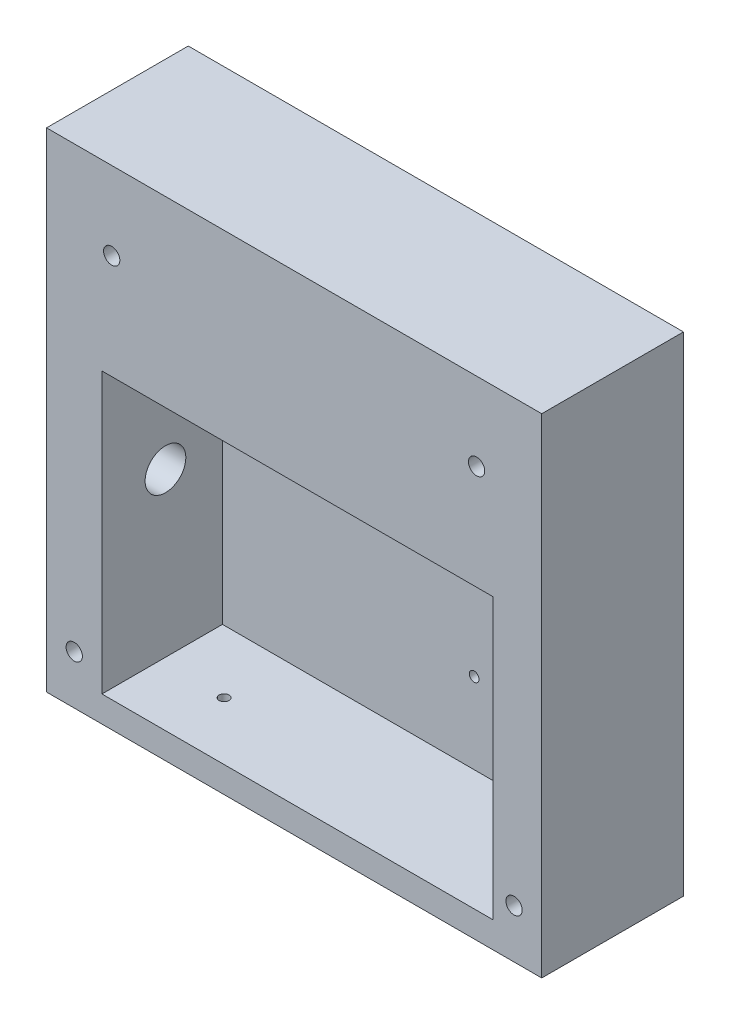
ISO-10303-21;
HEADER;
FILE_DESCRIPTION(('STEP AP214'),'2;1');
FILE_NAME('part.step','',(''),(''),'','','');
FILE_SCHEMA(('AUTOMOTIVE_DESIGN { 1 0 10303 214 1 1 1 1 }'));
ENDSEC;
DATA;
#1=APPLICATION_CONTEXT('core data for automotive mechanical design processes');
#2=APPLICATION_PROTOCOL_DEFINITION('international standard','automotive_design',2000,#1);
#3=PRODUCT_CONTEXT('',#1,'mechanical');
#4=PRODUCT('Part','Part','',(#3));
#5=PRODUCT_RELATED_PRODUCT_CATEGORY('part','',(#4));
#6=PRODUCT_DEFINITION_FORMATION('','',#4);
#7=PRODUCT_DEFINITION_CONTEXT('part definition',#1,'design');
#8=PRODUCT_DEFINITION('design','',#6,#7);
#9=PRODUCT_DEFINITION_SHAPE('','',#8);
#10=(LENGTH_UNIT() NAMED_UNIT(*) SI_UNIT(.MILLI.,.METRE.));
#11=(NAMED_UNIT(*) PLANE_ANGLE_UNIT() SI_UNIT($,.RADIAN.));
#12=(NAMED_UNIT(*) SI_UNIT($,.STERADIAN.) SOLID_ANGLE_UNIT());
#13=UNCERTAINTY_MEASURE_WITH_UNIT(LENGTH_MEASURE(1.E-05),#10,'distance_accuracy_value','');
#14=(GEOMETRIC_REPRESENTATION_CONTEXT(3) GLOBAL_UNCERTAINTY_ASSIGNED_CONTEXT((#13)) GLOBAL_UNIT_ASSIGNED_CONTEXT((#10,
#11,#12)) REPRESENTATION_CONTEXT('',''));
#15=CARTESIAN_POINT('',(0.,0.,0.));
#16=DIRECTION('',(0.,0.,1.));
#17=DIRECTION('',(1.,0.,0.));
#18=AXIS2_PLACEMENT_3D('',#15,#16,#17);
#19=CARTESIAN_POINT('',(0.,0.,6.5));
#20=DIRECTION('',(0.,1.,0.));
#21=DIRECTION('',(0.,0.,1.));
#22=AXIS2_PLACEMENT_3D('',#19,#20,#21);
#23=PLANE('',#22);
#24=CARTESIAN_POINT('',(124.25,0.,19.75));
#25=DIRECTION('',(0.,-1.,0.));
#26=DIRECTION('',(0.,0.,-1.));
#27=AXIS2_PLACEMENT_3D('',#24,#25,#26);
#28=CIRCLE('',#27,3.00000000000002);
#29=CARTESIAN_POINT('',(124.25,0.,16.75));
#30=VERTEX_POINT('',#29);
#31=EDGE_CURVE('E274',#30,#30,#28,.T.);
#32=ORIENTED_EDGE('',*,*,#31,.F.);
#33=EDGE_LOOP('',(#32));
#34=FACE_BOUND('',#33,.T.);
#35=DIRECTION('',(1.,0.,0.));
#36=VECTOR('',#35,1.);
#37=CARTESIAN_POINT('',(0.,0.,0.));
#38=LINE('',#37,#36);
#39=CARTESIAN_POINT('',(0.,0.,0.));
#40=VERTEX_POINT('',#39);
#41=CARTESIAN_POINT('',(152.,0.,0.));
#42=VERTEX_POINT('',#41);
#43=EDGE_CURVE('E162',#40,#42,#38,.T.);
#44=ORIENTED_EDGE('',*,*,#43,.T.);
#45=DIRECTION('',(0.,0.,-1.));
#46=VECTOR('',#45,1.);
#47=CARTESIAN_POINT('',(152.,0.,6.5));
#48=LINE('',#47,#46);
#49=CARTESIAN_POINT('',(152.,0.,43.5));
#50=VERTEX_POINT('',#49);
#51=EDGE_CURVE('E47',#50,#42,#48,.T.);
#52=ORIENTED_EDGE('',*,*,#51,.F.);
#53=DIRECTION('',(1.,0.,0.));
#54=VECTOR('',#53,1.);
#55=CARTESIAN_POINT('',(0.,0.,43.5));
#56=LINE('',#55,#54);
#57=CARTESIAN_POINT('',(0.,0.,43.5));
#58=VERTEX_POINT('',#57);
#59=EDGE_CURVE('E146',#58,#50,#56,.T.);
#60=ORIENTED_EDGE('',*,*,#59,.F.);
#61=DIRECTION('',(0.,0.,-1.));
#62=VECTOR('',#61,1.);
#63=CARTESIAN_POINT('',(0.,0.,6.5));
#64=LINE('',#63,#62);
#65=EDGE_CURVE('E11',#58,#40,#64,.T.);
#66=ORIENTED_EDGE('',*,*,#65,.T.);
#67=EDGE_LOOP('',(#44,#52,#60,#66));
#68=FACE_BOUND('',#67,.T.);
#69=CARTESIAN_POINT('',(36.75,0.,25.75));
#70=DIRECTION('',(0.,-1.,0.));
#71=DIRECTION('',(0.,0.,-1.));
#72=AXIS2_PLACEMENT_3D('',#69,#70,#71);
#73=CIRCLE('',#72,3.00000000000002);
#74=CARTESIAN_POINT('',(36.75,0.,22.75));
#75=VERTEX_POINT('',#74);
#76=EDGE_CURVE('E201',#75,#75,#73,.T.);
#77=ORIENTED_EDGE('',*,*,#76,.F.);
#78=EDGE_LOOP('',(#77));
#79=FACE_BOUND('',#78,.T.);
#80=ADVANCED_FACE('F38',(#34,#68,#79),#23,.F.);
#81=CARTESIAN_POINT('',(0.,0.,6.5));
#82=DIRECTION('',(0.,0.,-1.));
#83=DIRECTION('',(-1.,0.,0.));
#84=AXIS2_PLACEMENT_3D('',#81,#82,#83);
#85=PLANE('',#84);
#86=CARTESIAN_POINT('',(59.,60.75,6.5));
#87=DIRECTION('',(0.,0.,-1.));
#88=DIRECTION('',(-1.,0.,0.));
#89=AXIS2_PLACEMENT_3D('',#86,#87,#88);
#90=CIRCLE('',#89,1.50000000000002);
#91=CARTESIAN_POINT('',(57.5,60.75,6.5));
#92=VERTEX_POINT('',#91);
#93=EDGE_CURVE('E374',#92,#92,#90,.T.);
#94=ORIENTED_EDGE('',*,*,#93,.T.);
#95=EDGE_LOOP('',(#94));
#96=FACE_BOUND('',#95,.T.);
#97=CARTESIAN_POINT('',(94.25,60.75,6.5));
#98=DIRECTION('',(0.,0.,-1.));
#99=DIRECTION('',(-1.,0.,0.));
#100=AXIS2_PLACEMENT_3D('',#97,#98,#99);
#101=CIRCLE('',#100,1.50000000000002);
#102=CARTESIAN_POINT('',(92.75,60.75,6.5));
#103=VERTEX_POINT('',#102);
#104=EDGE_CURVE('E389',#103,#103,#101,.T.);
#105=ORIENTED_EDGE('',*,*,#104,.T.);
#106=EDGE_LOOP('',(#105));
#107=FACE_BOUND('',#106,.T.);
#108=CARTESIAN_POINT('',(94.25,32.75,6.5));
#109=DIRECTION('',(0.,0.,-1.));
#110=DIRECTION('',(-1.,0.,0.));
#111=AXIS2_PLACEMENT_3D('',#108,#109,#110);
#112=CIRCLE('',#111,1.50000000000002);
#113=CARTESIAN_POINT('',(92.75,32.75,6.5));
#114=VERTEX_POINT('',#113);
#115=EDGE_CURVE('E283',#114,#114,#112,.T.);
#116=ORIENTED_EDGE('',*,*,#115,.T.);
#117=EDGE_LOOP('',(#116));
#118=FACE_BOUND('',#117,.T.);
#119=DIRECTION('',(1.,0.,0.));
#120=VECTOR('',#119,1.);
#121=CARTESIAN_POINT('',(17.,93.88,6.5));
#122=LINE('',#121,#120);
#123=CARTESIAN_POINT('',(17.,93.88,6.5));
#124=VERTEX_POINT('',#123);
#125=CARTESIAN_POINT('',(137.,93.88,6.5));
#126=VERTEX_POINT('',#125);
#127=EDGE_CURVE('E108',#124,#126,#122,.T.);
#128=ORIENTED_EDGE('',*,*,#127,.F.);
#129=DIRECTION('',(0.,1.,0.));
#130=VECTOR('',#129,1.);
#131=CARTESIAN_POINT('',(17.,8.,6.5));
#132=LINE('',#131,#130);
#133=CARTESIAN_POINT('',(17.,8.,6.5));
#134=VERTEX_POINT('',#133);
#135=EDGE_CURVE('E118',#134,#124,#132,.T.);
#136=ORIENTED_EDGE('',*,*,#135,.F.);
#137=DIRECTION('',(-1.,0.,0.));
#138=VECTOR('',#137,1.);
#139=CARTESIAN_POINT('',(0.,8.,6.5));
#140=LINE('',#139,#138);
#141=CARTESIAN_POINT('',(137.,8.,6.5));
#142=VERTEX_POINT('',#141);
#143=EDGE_CURVE('E141',#142,#134,#140,.T.);
#144=ORIENTED_EDGE('',*,*,#143,.F.);
#145=DIRECTION('',(0.,-1.,0.));
#146=VECTOR('',#145,1.);
#147=CARTESIAN_POINT('',(137.,8.,6.5));
#148=LINE('',#147,#146);
#149=EDGE_CURVE('E120',#126,#142,#148,.T.);
#150=ORIENTED_EDGE('',*,*,#149,.F.);
#151=EDGE_LOOP('',(#128,#136,#144,#150));
#152=FACE_BOUND('',#151,.T.);
#153=ADVANCED_FACE('F197',(#96,#107,#118,#152),#85,.F.);
#154=CARTESIAN_POINT('',(17.,8.,43.5));
#155=DIRECTION('',(-1.,0.,0.));
#156=DIRECTION('',(0.,-1.,0.));
#157=AXIS2_PLACEMENT_3D('',#154,#155,#156);
#158=PLANE('',#157);
#159=CARTESIAN_POINT('',(17.,58.,24.));
#160=DIRECTION('',(1.,0.,0.));
#161=DIRECTION('',(0.,0.,-1.));
#162=AXIS2_PLACEMENT_3D('',#159,#160,#161);
#163=CIRCLE('',#162,6.25000000000001);
#164=CARTESIAN_POINT('',(17.,58.,17.75));
#165=VERTEX_POINT('',#164);
#166=EDGE_CURVE('E275',#165,#165,#163,.T.);
#167=ORIENTED_EDGE('',*,*,#166,.F.);
#168=EDGE_LOOP('',(#167));
#169=FACE_BOUND('',#168,.T.);
#170=DIRECTION('',(0.,0.,-1.));
#171=VECTOR('',#170,1.);
#172=CARTESIAN_POINT('',(17.,93.88,43.5));
#173=LINE('',#172,#171);
#174=CARTESIAN_POINT('',(17.,93.88,43.5));
#175=VERTEX_POINT('',#174);
#176=EDGE_CURVE('E104',#175,#124,#173,.T.);
#177=ORIENTED_EDGE('',*,*,#176,.F.);
#178=DIRECTION('',(0.,1.,0.));
#179=VECTOR('',#178,1.);
#180=CARTESIAN_POINT('',(17.,8.,43.5));
#181=LINE('',#180,#179);
#182=CARTESIAN_POINT('',(17.,8.,43.5));
#183=VERTEX_POINT('',#182);
#184=EDGE_CURVE('E115',#183,#175,#181,.T.);
#185=ORIENTED_EDGE('',*,*,#184,.F.);
#186=DIRECTION('',(0.,0.,-1.));
#187=VECTOR('',#186,1.);
#188=CARTESIAN_POINT('',(17.,8.,43.5));
#189=LINE('',#188,#187);
#190=EDGE_CURVE('E132',#183,#134,#189,.T.);
#191=ORIENTED_EDGE('',*,*,#190,.T.);
#192=ORIENTED_EDGE('',*,*,#135,.T.);
#193=EDGE_LOOP('',(#177,#185,#191,#192));
#194=FACE_BOUND('',#193,.T.);
#195=ADVANCED_FACE('F113',(#169,#194),#158,.F.);
#196=CARTESIAN_POINT('',(137.,8.,43.5));
#197=DIRECTION('',(1.,0.,0.));
#198=DIRECTION('',(0.,0.,-1.));
#199=AXIS2_PLACEMENT_3D('',#196,#197,#198);
#200=PLANE('',#199);
#201=DIRECTION('',(0.,0.,-1.));
#202=VECTOR('',#201,1.);
#203=CARTESIAN_POINT('',(137.,93.88,43.5));
#204=LINE('',#203,#202);
#205=CARTESIAN_POINT('',(137.,93.88,43.5));
#206=VERTEX_POINT('',#205);
#207=EDGE_CURVE('E54',#206,#126,#204,.T.);
#208=ORIENTED_EDGE('',*,*,#207,.T.);
#209=ORIENTED_EDGE('',*,*,#149,.T.);
#210=DIRECTION('',(0.,0.,-1.));
#211=VECTOR('',#210,1.);
#212=CARTESIAN_POINT('',(137.,8.,43.5));
#213=LINE('',#212,#211);
#214=CARTESIAN_POINT('',(137.,8.,43.5));
#215=VERTEX_POINT('',#214);
#216=EDGE_CURVE('E134',#215,#142,#213,.T.);
#217=ORIENTED_EDGE('',*,*,#216,.F.);
#218=DIRECTION('',(0.,-1.,0.));
#219=VECTOR('',#218,1.);
#220=CARTESIAN_POINT('',(137.,8.,43.5));
#221=LINE('',#220,#219);
#222=EDGE_CURVE('E61',#206,#215,#221,.T.);
#223=ORIENTED_EDGE('',*,*,#222,.F.);
#224=EDGE_LOOP('',(#208,#209,#217,#223));
#225=FACE_BOUND('',#224,.T.);
#226=ADVANCED_FACE('F233',(#225),#200,.F.);
#227=CARTESIAN_POINT('',(0.,8.,43.5));
#228=DIRECTION('',(0.,-1.,0.));
#229=DIRECTION('',(0.,0.,-1.));
#230=AXIS2_PLACEMENT_3D('',#227,#228,#229);
#231=PLANE('',#230);
#232=CARTESIAN_POINT('',(124.25,8.,19.75));
#233=DIRECTION('',(0.,-1.,0.));
#234=DIRECTION('',(0.,0.,-1.));
#235=AXIS2_PLACEMENT_3D('',#232,#233,#234);
#236=CIRCLE('',#235,1.50000000000002);
#237=CARTESIAN_POINT('',(124.25,8.,18.25));
#238=VERTEX_POINT('',#237);
#239=EDGE_CURVE('E205',#238,#238,#236,.T.);
#240=ORIENTED_EDGE('',*,*,#239,.T.);
#241=EDGE_LOOP('',(#240));
#242=FACE_BOUND('',#241,.T.);
#243=CARTESIAN_POINT('',(36.75,8.,25.75));
#244=DIRECTION('',(0.,-1.,0.));
#245=DIRECTION('',(0.,0.,-1.));
#246=AXIS2_PLACEMENT_3D('',#243,#244,#245);
#247=CIRCLE('',#246,1.50000000000002);
#248=CARTESIAN_POINT('',(36.75,8.,24.25));
#249=VERTEX_POINT('',#248);
#250=EDGE_CURVE('E220',#249,#249,#247,.T.);
#251=ORIENTED_EDGE('',*,*,#250,.T.);
#252=EDGE_LOOP('',(#251));
#253=FACE_BOUND('',#252,.T.);
#254=ORIENTED_EDGE('',*,*,#216,.T.);
#255=ORIENTED_EDGE('',*,*,#143,.T.);
#256=ORIENTED_EDGE('',*,*,#190,.F.);
#257=DIRECTION('',(-1.,0.,0.));
#258=VECTOR('',#257,1.);
#259=CARTESIAN_POINT('',(0.,8.,43.5));
#260=LINE('',#259,#258);
#261=EDGE_CURVE('E125',#215,#183,#260,.T.);
#262=ORIENTED_EDGE('',*,*,#261,.F.);
#263=EDGE_LOOP('',(#254,#255,#256,#262));
#264=FACE_BOUND('',#263,.T.);
#265=ADVANCED_FACE('F237',(#242,#253,#264),#231,.F.);
#266=CARTESIAN_POINT('',(0.,0.,6.5));
#267=DIRECTION('',(1.,0.,0.));
#268=DIRECTION('',(0.,0.,-1.));
#269=AXIS2_PLACEMENT_3D('',#266,#267,#268);
#270=PLANE('',#269);
#271=CARTESIAN_POINT('',(0.,58.,24.));
#272=DIRECTION('',(1.,0.,0.));
#273=DIRECTION('',(0.,0.,-1.));
#274=AXIS2_PLACEMENT_3D('',#271,#272,#273);
#275=CIRCLE('',#274,6.25000000000001);
#276=CARTESIAN_POINT('',(0.,58.,17.75));
#277=VERTEX_POINT('',#276);
#278=EDGE_CURVE('E271',#277,#277,#275,.T.);
#279=ORIENTED_EDGE('',*,*,#278,.T.);
#280=EDGE_LOOP('',(#279));
#281=FACE_BOUND('',#280,.T.);
#282=DIRECTION('',(0.,-1.,0.));
#283=VECTOR('',#282,1.);
#284=CARTESIAN_POINT('',(0.,0.,0.));
#285=LINE('',#284,#283);
#286=CARTESIAN_POINT('',(0.,150.,0.));
#287=VERTEX_POINT('',#286);
#288=EDGE_CURVE('E156',#287,#40,#285,.T.);
#289=ORIENTED_EDGE('',*,*,#288,.T.);
#290=ORIENTED_EDGE('',*,*,#65,.F.);
#291=DIRECTION('',(0.,-1.,0.));
#292=VECTOR('',#291,1.);
#293=CARTESIAN_POINT('',(0.,0.,43.5));
#294=LINE('',#293,#292);
#295=CARTESIAN_POINT('',(0.,150.,43.5));
#296=VERTEX_POINT('',#295);
#297=EDGE_CURVE('E142',#296,#58,#294,.T.);
#298=ORIENTED_EDGE('',*,*,#297,.F.);
#299=DIRECTION('',(0.,0.,-1.));
#300=VECTOR('',#299,1.);
#301=CARTESIAN_POINT('',(0.,150.,6.5));
#302=LINE('',#301,#300);
#303=EDGE_CURVE('E171',#296,#287,#302,.T.);
#304=ORIENTED_EDGE('',*,*,#303,.T.);
#305=EDGE_LOOP('',(#289,#290,#298,#304));
#306=FACE_BOUND('',#305,.T.);
#307=ADVANCED_FACE('F40',(#281,#306),#270,.F.);
#308=CARTESIAN_POINT('',(152.,0.,6.5));
#309=DIRECTION('',(-1.,0.,0.));
#310=DIRECTION('',(0.,0.,1.));
#311=AXIS2_PLACEMENT_3D('',#308,#309,#310);
#312=PLANE('',#311);
#313=DIRECTION('',(0.,1.,0.));
#314=VECTOR('',#313,1.);
#315=CARTESIAN_POINT('',(152.,0.,0.));
#316=LINE('',#315,#314);
#317=CARTESIAN_POINT('',(152.,150.,0.));
#318=VERTEX_POINT('',#317);
#319=EDGE_CURVE('E165',#42,#318,#316,.T.);
#320=ORIENTED_EDGE('',*,*,#319,.T.);
#321=DIRECTION('',(0.,0.,-1.));
#322=VECTOR('',#321,1.);
#323=CARTESIAN_POINT('',(152.,150.,6.5));
#324=LINE('',#323,#322);
#325=CARTESIAN_POINT('',(152.,150.,43.5));
#326=VERTEX_POINT('',#325);
#327=EDGE_CURVE('E175',#326,#318,#324,.T.);
#328=ORIENTED_EDGE('',*,*,#327,.F.);
#329=DIRECTION('',(0.,1.,0.));
#330=VECTOR('',#329,1.);
#331=CARTESIAN_POINT('',(152.,0.,43.5));
#332=LINE('',#331,#330);
#333=EDGE_CURVE('E150',#50,#326,#332,.T.);
#334=ORIENTED_EDGE('',*,*,#333,.F.);
#335=ORIENTED_EDGE('',*,*,#51,.T.);
#336=EDGE_LOOP('',(#320,#328,#334,#335));
#337=FACE_BOUND('',#336,.T.);
#338=ADVANCED_FACE('F183',(#337),#312,.F.);
#339=CARTESIAN_POINT('',(0.,150.,6.5));
#340=DIRECTION('',(0.,-1.,0.));
#341=DIRECTION('',(1.,0.,0.));
#342=AXIS2_PLACEMENT_3D('',#339,#340,#341);
#343=PLANE('',#342);
#344=DIRECTION('',(-1.,0.,0.));
#345=VECTOR('',#344,1.);
#346=CARTESIAN_POINT('',(0.,150.,0.));
#347=LINE('',#346,#345);
#348=EDGE_CURVE('E168',#318,#287,#347,.T.);
#349=ORIENTED_EDGE('',*,*,#348,.T.);
#350=ORIENTED_EDGE('',*,*,#303,.F.);
#351=DIRECTION('',(-1.,0.,0.));
#352=VECTOR('',#351,1.);
#353=CARTESIAN_POINT('',(0.,150.,43.5));
#354=LINE('',#353,#352);
#355=EDGE_CURVE('E127',#326,#296,#354,.T.);
#356=ORIENTED_EDGE('',*,*,#355,.F.);
#357=ORIENTED_EDGE('',*,*,#327,.T.);
#358=EDGE_LOOP('',(#349,#350,#356,#357));
#359=FACE_BOUND('',#358,.T.);
#360=ADVANCED_FACE('F192',(#359),#343,.F.);
#361=CARTESIAN_POINT('',(0.,0.,0.));
#362=DIRECTION('',(0.,0.,-1.));
#363=DIRECTION('',(-1.,0.,0.));
#364=AXIS2_PLACEMENT_3D('',#361,#362,#363);
#365=PLANE('',#364);
#366=CARTESIAN_POINT('',(143.5,15.,0.));
#367=DIRECTION('',(0.,0.,-1.));
#368=DIRECTION('',(-1.,0.,0.));
#369=AXIS2_PLACEMENT_3D('',#366,#367,#368);
#370=CIRCLE('',#369,5.);
#371=CARTESIAN_POINT('',(138.5,15.,0.));
#372=VERTEX_POINT('',#371);
#373=EDGE_CURVE('E506',#372,#372,#370,.T.);
#374=ORIENTED_EDGE('',*,*,#373,.F.);
#375=EDGE_LOOP('',(#374));
#376=FACE_BOUND('',#375,.T.);
#377=CARTESIAN_POINT('',(8.5,15.,0.));
#378=DIRECTION('',(0.,0.,-1.));
#379=DIRECTION('',(-1.,0.,0.));
#380=AXIS2_PLACEMENT_3D('',#377,#378,#379);
#381=CIRCLE('',#380,5.00000000000001);
#382=CARTESIAN_POINT('',(3.49999999999999,15.,0.));
#383=VERTEX_POINT('',#382);
#384=EDGE_CURVE('E518',#383,#383,#381,.T.);
#385=ORIENTED_EDGE('',*,*,#384,.F.);
#386=EDGE_LOOP('',(#385));
#387=FACE_BOUND('',#386,.T.);
#388=CARTESIAN_POINT('',(132.,126.,0.));
#389=DIRECTION('',(0.,0.,-1.));
#390=DIRECTION('',(-1.,0.,0.));
#391=AXIS2_PLACEMENT_3D('',#388,#389,#390);
#392=CIRCLE('',#391,5.);
#393=CARTESIAN_POINT('',(127.,126.,0.));
#394=VERTEX_POINT('',#393);
#395=EDGE_CURVE('E532',#394,#394,#392,.T.);
#396=ORIENTED_EDGE('',*,*,#395,.F.);
#397=EDGE_LOOP('',(#396));
#398=FACE_BOUND('',#397,.T.);
#399=CARTESIAN_POINT('',(20.,126.,0.));
#400=DIRECTION('',(0.,0.,-1.));
#401=DIRECTION('',(-1.,0.,0.));
#402=AXIS2_PLACEMENT_3D('',#399,#400,#401);
#403=CIRCLE('',#402,5.00000000000001);
#404=CARTESIAN_POINT('',(15.,126.,0.));
#405=VERTEX_POINT('',#404);
#406=EDGE_CURVE('E546',#405,#405,#403,.T.);
#407=ORIENTED_EDGE('',*,*,#406,.F.);
#408=EDGE_LOOP('',(#407));
#409=FACE_BOUND('',#408,.T.);
#410=CARTESIAN_POINT('',(59.,60.75,0.));
#411=DIRECTION('',(0.,0.,-1.));
#412=DIRECTION('',(-1.,0.,0.));
#413=AXIS2_PLACEMENT_3D('',#410,#411,#412);
#414=CIRCLE('',#413,3.00000000000001);
#415=CARTESIAN_POINT('',(56.,60.75,0.));
#416=VERTEX_POINT('',#415);
#417=EDGE_CURVE('E354',#416,#416,#414,.T.);
#418=ORIENTED_EDGE('',*,*,#417,.F.);
#419=EDGE_LOOP('',(#418));
#420=FACE_BOUND('',#419,.T.);
#421=CARTESIAN_POINT('',(94.25,60.75,0.));
#422=DIRECTION('',(0.,0.,-1.));
#423=DIRECTION('',(-1.,0.,0.));
#424=AXIS2_PLACEMENT_3D('',#421,#422,#423);
#425=CIRCLE('',#424,3.00000000000002);
#426=CARTESIAN_POINT('',(91.25,60.75,0.));
#427=VERTEX_POINT('',#426);
#428=EDGE_CURVE('E377',#427,#427,#425,.T.);
#429=ORIENTED_EDGE('',*,*,#428,.F.);
#430=EDGE_LOOP('',(#429));
#431=FACE_BOUND('',#430,.T.);
#432=CARTESIAN_POINT('',(94.25,32.75,0.));
#433=DIRECTION('',(0.,0.,-1.));
#434=DIRECTION('',(-1.,0.,0.));
#435=AXIS2_PLACEMENT_3D('',#432,#433,#434);
#436=CIRCLE('',#435,3.00000000000002);
#437=CARTESIAN_POINT('',(91.25,32.75,0.));
#438=VERTEX_POINT('',#437);
#439=EDGE_CURVE('E393',#438,#438,#436,.T.);
#440=ORIENTED_EDGE('',*,*,#439,.F.);
#441=EDGE_LOOP('',(#440));
#442=FACE_BOUND('',#441,.T.);
#443=ORIENTED_EDGE('',*,*,#288,.F.);
#444=ORIENTED_EDGE('',*,*,#348,.F.);
#445=ORIENTED_EDGE('',*,*,#319,.F.);
#446=ORIENTED_EDGE('',*,*,#43,.F.);
#447=EDGE_LOOP('',(#443,#444,#445,#446));
#448=FACE_BOUND('',#447,.T.);
#449=ADVANCED_FACE('F190',(#376,#387,#398,#409,#420,#431,#442,#448),#365,.T.);
#450=CARTESIAN_POINT('',(0.,0.,43.5));
#451=DIRECTION('',(0.,0.,-1.));
#452=DIRECTION('',(-1.,0.,0.));
#453=AXIS2_PLACEMENT_3D('',#450,#451,#452);
#454=PLANE('',#453);
#455=CARTESIAN_POINT('',(143.5,15.,43.5));
#456=DIRECTION('',(0.,0.,-1.));
#457=DIRECTION('',(-1.,0.,0.));
#458=AXIS2_PLACEMENT_3D('',#455,#456,#457);
#459=CIRCLE('',#458,2.5);
#460=CARTESIAN_POINT('',(141.,15.,43.5));
#461=VERTEX_POINT('',#460);
#462=EDGE_CURVE('E340',#461,#461,#459,.T.);
#463=ORIENTED_EDGE('',*,*,#462,.T.);
#464=EDGE_LOOP('',(#463));
#465=FACE_BOUND('',#464,.T.);
#466=CARTESIAN_POINT('',(8.5,15.,43.5));
#467=DIRECTION('',(0.,0.,-1.));
#468=DIRECTION('',(-1.,0.,0.));
#469=AXIS2_PLACEMENT_3D('',#466,#467,#468);
#470=CIRCLE('',#469,2.50000000000001);
#471=CARTESIAN_POINT('',(5.99999999999999,15.,43.5));
#472=VERTEX_POINT('',#471);
#473=EDGE_CURVE('E344',#472,#472,#470,.T.);
#474=ORIENTED_EDGE('',*,*,#473,.T.);
#475=EDGE_LOOP('',(#474));
#476=FACE_BOUND('',#475,.T.);
#477=CARTESIAN_POINT('',(132.,126.,43.5));
#478=DIRECTION('',(0.,0.,-1.));
#479=DIRECTION('',(-1.,0.,0.));
#480=AXIS2_PLACEMENT_3D('',#477,#478,#479);
#481=CIRCLE('',#480,2.5);
#482=CARTESIAN_POINT('',(129.5,126.,43.5));
#483=VERTEX_POINT('',#482);
#484=EDGE_CURVE('E348',#483,#483,#481,.T.);
#485=ORIENTED_EDGE('',*,*,#484,.T.);
#486=EDGE_LOOP('',(#485));
#487=FACE_BOUND('',#486,.T.);
#488=CARTESIAN_POINT('',(20.,126.,43.5));
#489=DIRECTION('',(0.,0.,-1.));
#490=DIRECTION('',(-1.,0.,0.));
#491=AXIS2_PLACEMENT_3D('',#488,#489,#490);
#492=CIRCLE('',#491,2.50000000000001);
#493=CARTESIAN_POINT('',(17.5,126.,43.5));
#494=VERTEX_POINT('',#493);
#495=EDGE_CURVE('E351',#494,#494,#492,.T.);
#496=ORIENTED_EDGE('',*,*,#495,.T.);
#497=EDGE_LOOP('',(#496));
#498=FACE_BOUND('',#497,.T.);
#499=ORIENTED_EDGE('',*,*,#184,.T.);
#500=DIRECTION('',(1.,0.,0.));
#501=VECTOR('',#500,1.);
#502=CARTESIAN_POINT('',(17.,93.88,43.5));
#503=LINE('',#502,#501);
#504=EDGE_CURVE('E101',#175,#206,#503,.T.);
#505=ORIENTED_EDGE('',*,*,#504,.T.);
#506=ORIENTED_EDGE('',*,*,#222,.T.);
#507=ORIENTED_EDGE('',*,*,#261,.T.);
#508=EDGE_LOOP('',(#499,#505,#506,#507));
#509=FACE_BOUND('',#508,.T.);
#510=ORIENTED_EDGE('',*,*,#297,.T.);
#511=ORIENTED_EDGE('',*,*,#59,.T.);
#512=ORIENTED_EDGE('',*,*,#333,.T.);
#513=ORIENTED_EDGE('',*,*,#355,.T.);
#514=EDGE_LOOP('',(#510,#511,#512,#513));
#515=FACE_BOUND('',#514,.T.);
#516=ADVANCED_FACE('F122',(#465,#476,#487,#498,#509,#515),#454,.F.);
#517=CARTESIAN_POINT('',(17.,93.88,43.5));
#518=DIRECTION('',(0.,1.,0.));
#519=DIRECTION('',(0.,0.,1.));
#520=AXIS2_PLACEMENT_3D('',#517,#518,#519);
#521=PLANE('',#520);
#522=ORIENTED_EDGE('',*,*,#127,.T.);
#523=ORIENTED_EDGE('',*,*,#207,.F.);
#524=ORIENTED_EDGE('',*,*,#504,.F.);
#525=ORIENTED_EDGE('',*,*,#176,.T.);
#526=EDGE_LOOP('',(#522,#523,#524,#525));
#527=FACE_BOUND('',#526,.T.);
#528=ADVANCED_FACE('F103',(#527),#521,.F.);
#529=CARTESIAN_POINT('',(36.75,0.,25.75));
#530=DIRECTION('',(0.,-1.,0.));
#531=DIRECTION('',(0.,0.,-1.));
#532=AXIS2_PLACEMENT_3D('',#529,#530,#531);
#533=CYLINDRICAL_SURFACE('',#532,1.50000000000002);
#534=ORIENTED_EDGE('',*,*,#250,.F.);
#535=EDGE_LOOP('',(#534));
#536=FACE_BOUND('',#535,.T.);
#537=CARTESIAN_POINT('',(36.75,4.5,25.75));
#538=DIRECTION('',(0.,-1.,0.));
#539=DIRECTION('',(0.,0.,-1.));
#540=AXIS2_PLACEMENT_3D('',#537,#538,#539);
#541=CIRCLE('',#540,1.50000000000002);
#542=CARTESIAN_POINT('',(36.75,4.5,24.25));
#543=VERTEX_POINT('',#542);
#544=EDGE_CURVE('E210',#543,#543,#541,.T.);
#545=ORIENTED_EDGE('',*,*,#544,.T.);
#546=EDGE_LOOP('',(#545));
#547=FACE_BOUND('',#546,.T.);
#548=ADVANCED_FACE('F324',(#536,#547),#533,.F.);
#549=CARTESIAN_POINT('',(38.25,4.5,25.75));
#550=DIRECTION('',(0.,1.,0.));
#551=DIRECTION('',(0.,0.,1.));
#552=AXIS2_PLACEMENT_3D('',#549,#550,#551);
#553=PLANE('',#552);
#554=ORIENTED_EDGE('',*,*,#544,.F.);
#555=EDGE_LOOP('',(#554));
#556=FACE_BOUND('',#555,.T.);
#557=CARTESIAN_POINT('',(36.75,4.5,25.75));
#558=DIRECTION('',(0.,-1.,0.));
#559=DIRECTION('',(0.,0.,-1.));
#560=AXIS2_PLACEMENT_3D('',#557,#558,#559);
#561=CIRCLE('',#560,3.00000000000002);
#562=CARTESIAN_POINT('',(36.75,4.5,22.75));
#563=VERTEX_POINT('',#562);
#564=EDGE_CURVE('E204',#563,#563,#561,.T.);
#565=ORIENTED_EDGE('',*,*,#564,.T.);
#566=EDGE_LOOP('',(#565));
#567=FACE_BOUND('',#566,.T.);
#568=ADVANCED_FACE('F320',(#556,#567),#553,.F.);
#569=CARTESIAN_POINT('',(36.75,0.,25.75));
#570=DIRECTION('',(0.,-1.,0.));
#571=DIRECTION('',(0.,0.,-1.));
#572=AXIS2_PLACEMENT_3D('',#569,#570,#571);
#573=CYLINDRICAL_SURFACE('',#572,3.00000000000002);
#574=ORIENTED_EDGE('',*,*,#564,.F.);
#575=EDGE_LOOP('',(#574));
#576=FACE_BOUND('',#575,.T.);
#577=ORIENTED_EDGE('',*,*,#76,.T.);
#578=EDGE_LOOP('',(#577));
#579=FACE_BOUND('',#578,.T.);
#580=ADVANCED_FACE('F316',(#576,#579),#573,.F.);
#581=CARTESIAN_POINT('',(124.25,0.,19.75));
#582=DIRECTION('',(0.,-1.,0.));
#583=DIRECTION('',(0.,0.,-1.));
#584=AXIS2_PLACEMENT_3D('',#581,#582,#583);
#585=CYLINDRICAL_SURFACE('',#584,1.50000000000002);
#586=ORIENTED_EDGE('',*,*,#239,.F.);
#587=EDGE_LOOP('',(#586));
#588=FACE_BOUND('',#587,.T.);
#589=CARTESIAN_POINT('',(124.25,4.5,19.75));
#590=DIRECTION('',(0.,-1.,0.));
#591=DIRECTION('',(0.,0.,-1.));
#592=AXIS2_PLACEMENT_3D('',#589,#590,#591);
#593=CIRCLE('',#592,1.50000000000002);
#594=CARTESIAN_POINT('',(124.25,4.5,18.25));
#595=VERTEX_POINT('',#594);
#596=EDGE_CURVE('E213',#595,#595,#593,.T.);
#597=ORIENTED_EDGE('',*,*,#596,.T.);
#598=EDGE_LOOP('',(#597));
#599=FACE_BOUND('',#598,.T.);
#600=ADVANCED_FACE('F293',(#588,#599),#585,.F.);
#601=CARTESIAN_POINT('',(125.75,4.5,19.75));
#602=DIRECTION('',(0.,1.,0.));
#603=DIRECTION('',(0.,0.,1.));
#604=AXIS2_PLACEMENT_3D('',#601,#602,#603);
#605=PLANE('',#604);
#606=ORIENTED_EDGE('',*,*,#596,.F.);
#607=EDGE_LOOP('',(#606));
#608=FACE_BOUND('',#607,.T.);
#609=CARTESIAN_POINT('',(124.25,4.5,19.75));
#610=DIRECTION('',(0.,-1.,0.));
#611=DIRECTION('',(0.,0.,-1.));
#612=AXIS2_PLACEMENT_3D('',#609,#610,#611);
#613=CIRCLE('',#612,3.00000000000002);
#614=CARTESIAN_POINT('',(124.25,4.5,16.75));
#615=VERTEX_POINT('',#614);
#616=EDGE_CURVE('E280',#615,#615,#613,.T.);
#617=ORIENTED_EDGE('',*,*,#616,.T.);
#618=EDGE_LOOP('',(#617));
#619=FACE_BOUND('',#618,.T.);
#620=ADVANCED_FACE('F295',(#608,#619),#605,.F.);
#621=CARTESIAN_POINT('',(124.25,0.,19.75));
#622=DIRECTION('',(0.,-1.,0.));
#623=DIRECTION('',(0.,0.,-1.));
#624=AXIS2_PLACEMENT_3D('',#621,#622,#623);
#625=CYLINDRICAL_SURFACE('',#624,3.00000000000002);
#626=ORIENTED_EDGE('',*,*,#616,.F.);
#627=EDGE_LOOP('',(#626));
#628=FACE_BOUND('',#627,.T.);
#629=ORIENTED_EDGE('',*,*,#31,.T.);
#630=EDGE_LOOP('',(#629));
#631=FACE_BOUND('',#630,.T.);
#632=ADVANCED_FACE('F298',(#628,#631),#625,.F.);
#633=CARTESIAN_POINT('',(17.,58.,24.));
#634=DIRECTION('',(1.,0.,0.));
#635=DIRECTION('',(0.,0.,-1.));
#636=AXIS2_PLACEMENT_3D('',#633,#634,#635);
#637=CYLINDRICAL_SURFACE('',#636,6.25000000000001);
#638=ORIENTED_EDGE('',*,*,#278,.F.);
#639=EDGE_LOOP('',(#638));
#640=FACE_BOUND('',#639,.T.);
#641=ORIENTED_EDGE('',*,*,#166,.T.);
#642=EDGE_LOOP('',(#641));
#643=FACE_BOUND('',#642,.T.);
#644=ADVANCED_FACE('F304',(#640,#643),#637,.F.);
#645=CARTESIAN_POINT('',(94.25,32.75,0.));
#646=DIRECTION('',(0.,0.,-1.));
#647=DIRECTION('',(-1.,0.,0.));
#648=AXIS2_PLACEMENT_3D('',#645,#646,#647);
#649=CYLINDRICAL_SURFACE('',#648,1.50000000000002);
#650=ORIENTED_EDGE('',*,*,#115,.F.);
#651=EDGE_LOOP('',(#650));
#652=FACE_BOUND('',#651,.T.);
#653=CARTESIAN_POINT('',(94.25,32.75,4.));
#654=DIRECTION('',(0.,0.,-1.));
#655=DIRECTION('',(-1.,0.,0.));
#656=AXIS2_PLACEMENT_3D('',#653,#654,#655);
#657=CIRCLE('',#656,1.50000000000002);
#658=CARTESIAN_POINT('',(92.75,32.75,4.));
#659=VERTEX_POINT('',#658);
#660=EDGE_CURVE('E401',#659,#659,#657,.T.);
#661=ORIENTED_EDGE('',*,*,#660,.T.);
#662=EDGE_LOOP('',(#661));
#663=FACE_BOUND('',#662,.T.);
#664=ADVANCED_FACE('F310',(#652,#663),#649,.F.);
#665=CARTESIAN_POINT('',(95.75,32.75,4.));
#666=DIRECTION('',(0.,0.,1.));
#667=DIRECTION('',(1.,0.,0.));
#668=AXIS2_PLACEMENT_3D('',#665,#666,#667);
#669=PLANE('',#668);
#670=ORIENTED_EDGE('',*,*,#660,.F.);
#671=EDGE_LOOP('',(#670));
#672=FACE_BOUND('',#671,.T.);
#673=CARTESIAN_POINT('',(94.25,32.75,4.));
#674=DIRECTION('',(0.,0.,-1.));
#675=DIRECTION('',(-1.,0.,0.));
#676=AXIS2_PLACEMENT_3D('',#673,#674,#675);
#677=CIRCLE('',#676,3.00000000000002);
#678=CARTESIAN_POINT('',(91.25,32.75,4.));
#679=VERTEX_POINT('',#678);
#680=EDGE_CURVE('E397',#679,#679,#677,.T.);
#681=ORIENTED_EDGE('',*,*,#680,.T.);
#682=EDGE_LOOP('',(#681));
#683=FACE_BOUND('',#682,.T.);
#684=ADVANCED_FACE('F411',(#672,#683),#669,.F.);
#685=CARTESIAN_POINT('',(94.25,32.75,0.));
#686=DIRECTION('',(0.,0.,-1.));
#687=DIRECTION('',(-1.,0.,0.));
#688=AXIS2_PLACEMENT_3D('',#685,#686,#687);
#689=CYLINDRICAL_SURFACE('',#688,3.00000000000002);
#690=ORIENTED_EDGE('',*,*,#680,.F.);
#691=EDGE_LOOP('',(#690));
#692=FACE_BOUND('',#691,.T.);
#693=ORIENTED_EDGE('',*,*,#439,.T.);
#694=EDGE_LOOP('',(#693));
#695=FACE_BOUND('',#694,.T.);
#696=ADVANCED_FACE('F416',(#692,#695),#689,.F.);
#697=CARTESIAN_POINT('',(94.25,60.75,0.));
#698=DIRECTION('',(0.,0.,-1.));
#699=DIRECTION('',(-1.,0.,0.));
#700=AXIS2_PLACEMENT_3D('',#697,#698,#699);
#701=CYLINDRICAL_SURFACE('',#700,1.50000000000002);
#702=ORIENTED_EDGE('',*,*,#104,.F.);
#703=EDGE_LOOP('',(#702));
#704=FACE_BOUND('',#703,.T.);
#705=CARTESIAN_POINT('',(94.25,60.75,4.));
#706=DIRECTION('',(0.,0.,-1.));
#707=DIRECTION('',(-1.,0.,0.));
#708=AXIS2_PLACEMENT_3D('',#705,#706,#707);
#709=CIRCLE('',#708,1.50000000000002);
#710=CARTESIAN_POINT('',(92.75,60.75,4.));
#711=VERTEX_POINT('',#710);
#712=EDGE_CURVE('E385',#711,#711,#709,.T.);
#713=ORIENTED_EDGE('',*,*,#712,.T.);
#714=EDGE_LOOP('',(#713));
#715=FACE_BOUND('',#714,.T.);
#716=ADVANCED_FACE('F422',(#704,#715),#701,.F.);
#717=CARTESIAN_POINT('',(95.75,60.75,4.));
#718=DIRECTION('',(0.,0.,1.));
#719=DIRECTION('',(1.,0.,0.));
#720=AXIS2_PLACEMENT_3D('',#717,#718,#719);
#721=PLANE('',#720);
#722=ORIENTED_EDGE('',*,*,#712,.F.);
#723=EDGE_LOOP('',(#722));
#724=FACE_BOUND('',#723,.T.);
#725=CARTESIAN_POINT('',(94.25,60.75,4.));
#726=DIRECTION('',(0.,0.,-1.));
#727=DIRECTION('',(-1.,0.,0.));
#728=AXIS2_PLACEMENT_3D('',#725,#726,#727);
#729=CIRCLE('',#728,3.00000000000002);
#730=CARTESIAN_POINT('',(91.25,60.75,4.));
#731=VERTEX_POINT('',#730);
#732=EDGE_CURVE('E381',#731,#731,#729,.T.);
#733=ORIENTED_EDGE('',*,*,#732,.T.);
#734=EDGE_LOOP('',(#733));
#735=FACE_BOUND('',#734,.T.);
#736=ADVANCED_FACE('F429',(#724,#735),#721,.F.);
#737=CARTESIAN_POINT('',(94.25,60.75,0.));
#738=DIRECTION('',(0.,0.,-1.));
#739=DIRECTION('',(-1.,0.,0.));
#740=AXIS2_PLACEMENT_3D('',#737,#738,#739);
#741=CYLINDRICAL_SURFACE('',#740,3.00000000000002);
#742=ORIENTED_EDGE('',*,*,#732,.F.);
#743=EDGE_LOOP('',(#742));
#744=FACE_BOUND('',#743,.T.);
#745=ORIENTED_EDGE('',*,*,#428,.T.);
#746=EDGE_LOOP('',(#745));
#747=FACE_BOUND('',#746,.T.);
#748=ADVANCED_FACE('F435',(#744,#747),#741,.F.);
#749=CARTESIAN_POINT('',(59.,60.75,0.));
#750=DIRECTION('',(0.,0.,-1.));
#751=DIRECTION('',(-1.,0.,0.));
#752=AXIS2_PLACEMENT_3D('',#749,#750,#751);
#753=CYLINDRICAL_SURFACE('',#752,1.50000000000002);
#754=ORIENTED_EDGE('',*,*,#93,.F.);
#755=EDGE_LOOP('',(#754));
#756=FACE_BOUND('',#755,.T.);
#757=CARTESIAN_POINT('',(59.,60.75,4.));
#758=DIRECTION('',(0.,0.,-1.));
#759=DIRECTION('',(-1.,0.,0.));
#760=AXIS2_PLACEMENT_3D('',#757,#758,#759);
#761=CIRCLE('',#760,1.50000000000002);
#762=CARTESIAN_POINT('',(57.5,60.75,4.));
#763=VERTEX_POINT('',#762);
#764=EDGE_CURVE('E370',#763,#763,#761,.T.);
#765=ORIENTED_EDGE('',*,*,#764,.T.);
#766=EDGE_LOOP('',(#765));
#767=FACE_BOUND('',#766,.T.);
#768=ADVANCED_FACE('F439',(#756,#767),#753,.F.);
#769=CARTESIAN_POINT('',(60.5,60.75,4.));
#770=DIRECTION('',(0.,0.,1.));
#771=DIRECTION('',(1.,0.,0.));
#772=AXIS2_PLACEMENT_3D('',#769,#770,#771);
#773=PLANE('',#772);
#774=ORIENTED_EDGE('',*,*,#764,.F.);
#775=EDGE_LOOP('',(#774));
#776=FACE_BOUND('',#775,.T.);
#777=CARTESIAN_POINT('',(59.,60.75,4.));
#778=DIRECTION('',(0.,0.,-1.));
#779=DIRECTION('',(-1.,0.,0.));
#780=AXIS2_PLACEMENT_3D('',#777,#778,#779);
#781=CIRCLE('',#780,3.00000000000001);
#782=CARTESIAN_POINT('',(56.,60.75,4.));
#783=VERTEX_POINT('',#782);
#784=EDGE_CURVE('E360',#783,#783,#781,.T.);
#785=ORIENTED_EDGE('',*,*,#784,.T.);
#786=EDGE_LOOP('',(#785));
#787=FACE_BOUND('',#786,.T.);
#788=ADVANCED_FACE('F443',(#776,#787),#773,.F.);
#789=CARTESIAN_POINT('',(59.,60.75,0.));
#790=DIRECTION('',(0.,0.,-1.));
#791=DIRECTION('',(-1.,0.,0.));
#792=AXIS2_PLACEMENT_3D('',#789,#790,#791);
#793=CYLINDRICAL_SURFACE('',#792,3.00000000000001);
#794=ORIENTED_EDGE('',*,*,#784,.F.);
#795=EDGE_LOOP('',(#794));
#796=FACE_BOUND('',#795,.T.);
#797=ORIENTED_EDGE('',*,*,#417,.T.);
#798=EDGE_LOOP('',(#797));
#799=FACE_BOUND('',#798,.T.);
#800=ADVANCED_FACE('F447',(#796,#799),#793,.F.);
#801=CARTESIAN_POINT('',(20.,126.,0.));
#802=DIRECTION('',(0.,0.,-1.));
#803=DIRECTION('',(-1.,0.,0.));
#804=AXIS2_PLACEMENT_3D('',#801,#802,#803);
#805=CYLINDRICAL_SURFACE('',#804,2.50000000000001);
#806=ORIENTED_EDGE('',*,*,#495,.F.);
#807=EDGE_LOOP('',(#806));
#808=FACE_BOUND('',#807,.T.);
#809=CARTESIAN_POINT('',(20.,126.,23.5));
#810=DIRECTION('',(0.,0.,-1.));
#811=DIRECTION('',(-1.,0.,0.));
#812=AXIS2_PLACEMENT_3D('',#809,#810,#811);
#813=CIRCLE('',#812,2.50000000000001);
#814=CARTESIAN_POINT('',(17.5,126.,23.5));
#815=VERTEX_POINT('',#814);
#816=EDGE_CURVE('E355',#815,#815,#813,.T.);
#817=ORIENTED_EDGE('',*,*,#816,.T.);
#818=EDGE_LOOP('',(#817));
#819=FACE_BOUND('',#818,.T.);
#820=ADVANCED_FACE('F451',(#808,#819),#805,.F.);
#821=CARTESIAN_POINT('',(22.5,126.,23.5));
#822=DIRECTION('',(0.,0.,1.));
#823=DIRECTION('',(1.,0.,0.));
#824=AXIS2_PLACEMENT_3D('',#821,#822,#823);
#825=PLANE('',#824);
#826=ORIENTED_EDGE('',*,*,#816,.F.);
#827=EDGE_LOOP('',(#826));
#828=FACE_BOUND('',#827,.T.);
#829=CARTESIAN_POINT('',(20.,126.,23.5));
#830=DIRECTION('',(0.,0.,-1.));
#831=DIRECTION('',(-1.,0.,0.));
#832=AXIS2_PLACEMENT_3D('',#829,#830,#831);
#833=CIRCLE('',#832,5.00000000000001);
#834=CARTESIAN_POINT('',(15.,126.,23.5));
#835=VERTEX_POINT('',#834);
#836=EDGE_CURVE('E363',#835,#835,#833,.T.);
#837=ORIENTED_EDGE('',*,*,#836,.T.);
#838=EDGE_LOOP('',(#837));
#839=FACE_BOUND('',#838,.T.);
#840=ADVANCED_FACE('F455',(#828,#839),#825,.F.);
#841=CARTESIAN_POINT('',(20.,126.,0.));
#842=DIRECTION('',(0.,0.,-1.));
#843=DIRECTION('',(-1.,0.,0.));
#844=AXIS2_PLACEMENT_3D('',#841,#842,#843);
#845=CYLINDRICAL_SURFACE('',#844,5.00000000000001);
#846=ORIENTED_EDGE('',*,*,#836,.F.);
#847=EDGE_LOOP('',(#846));
#848=FACE_BOUND('',#847,.T.);
#849=ORIENTED_EDGE('',*,*,#406,.T.);
#850=EDGE_LOOP('',(#849));
#851=FACE_BOUND('',#850,.T.);
#852=ADVANCED_FACE('F458',(#848,#851),#845,.F.);
#853=CARTESIAN_POINT('',(132.,126.,0.));
#854=DIRECTION('',(0.,0.,-1.));
#855=DIRECTION('',(-1.,0.,0.));
#856=AXIS2_PLACEMENT_3D('',#853,#854,#855);
#857=CYLINDRICAL_SURFACE('',#856,2.5);
#858=ORIENTED_EDGE('',*,*,#484,.F.);
#859=EDGE_LOOP('',(#858));
#860=FACE_BOUND('',#859,.T.);
#861=CARTESIAN_POINT('',(132.,126.,23.5));
#862=DIRECTION('',(0.,0.,-1.));
#863=DIRECTION('',(-1.,0.,0.));
#864=AXIS2_PLACEMENT_3D('',#861,#862,#863);
#865=CIRCLE('',#864,2.5);
#866=CARTESIAN_POINT('',(129.5,126.,23.5));
#867=VERTEX_POINT('',#866);
#868=EDGE_CURVE('E540',#867,#867,#865,.T.);
#869=ORIENTED_EDGE('',*,*,#868,.T.);
#870=EDGE_LOOP('',(#869));
#871=FACE_BOUND('',#870,.T.);
#872=ADVANCED_FACE('F462',(#860,#871),#857,.F.);
#873=CARTESIAN_POINT('',(134.5,126.,23.5));
#874=DIRECTION('',(0.,0.,1.));
#875=DIRECTION('',(1.,0.,0.));
#876=AXIS2_PLACEMENT_3D('',#873,#874,#875);
#877=PLANE('',#876);
#878=ORIENTED_EDGE('',*,*,#868,.F.);
#879=EDGE_LOOP('',(#878));
#880=FACE_BOUND('',#879,.T.);
#881=CARTESIAN_POINT('',(132.,126.,23.5));
#882=DIRECTION('',(0.,0.,-1.));
#883=DIRECTION('',(-1.,0.,0.));
#884=AXIS2_PLACEMENT_3D('',#881,#882,#883);
#885=CIRCLE('',#884,5.);
#886=CARTESIAN_POINT('',(127.,126.,23.5));
#887=VERTEX_POINT('',#886);
#888=EDGE_CURVE('E536',#887,#887,#885,.T.);
#889=ORIENTED_EDGE('',*,*,#888,.T.);
#890=EDGE_LOOP('',(#889));
#891=FACE_BOUND('',#890,.T.);
#892=ADVANCED_FACE('F466',(#880,#891),#877,.F.);
#893=CARTESIAN_POINT('',(132.,126.,0.));
#894=DIRECTION('',(0.,0.,-1.));
#895=DIRECTION('',(-1.,0.,0.));
#896=AXIS2_PLACEMENT_3D('',#893,#894,#895);
#897=CYLINDRICAL_SURFACE('',#896,5.);
#898=ORIENTED_EDGE('',*,*,#888,.F.);
#899=EDGE_LOOP('',(#898));
#900=FACE_BOUND('',#899,.T.);
#901=ORIENTED_EDGE('',*,*,#395,.T.);
#902=EDGE_LOOP('',(#901));
#903=FACE_BOUND('',#902,.T.);
#904=ADVANCED_FACE('F470',(#900,#903),#897,.F.);
#905=CARTESIAN_POINT('',(8.5,15.,0.));
#906=DIRECTION('',(0.,0.,-1.));
#907=DIRECTION('',(-1.,0.,0.));
#908=AXIS2_PLACEMENT_3D('',#905,#906,#907);
#909=CYLINDRICAL_SURFACE('',#908,2.50000000000001);
#910=ORIENTED_EDGE('',*,*,#473,.F.);
#911=EDGE_LOOP('',(#910));
#912=FACE_BOUND('',#911,.T.);
#913=CARTESIAN_POINT('',(8.5,15.,23.5));
#914=DIRECTION('',(0.,0.,-1.));
#915=DIRECTION('',(-1.,0.,0.));
#916=AXIS2_PLACEMENT_3D('',#913,#914,#915);
#917=CIRCLE('',#916,2.50000000000001);
#918=CARTESIAN_POINT('',(5.99999999999999,15.,23.5));
#919=VERTEX_POINT('',#918);
#920=EDGE_CURVE('E526',#919,#919,#917,.T.);
#921=ORIENTED_EDGE('',*,*,#920,.T.);
#922=EDGE_LOOP('',(#921));
#923=FACE_BOUND('',#922,.T.);
#924=ADVANCED_FACE('F474',(#912,#923),#909,.F.);
#925=CARTESIAN_POINT('',(11.,15.,23.5));
#926=DIRECTION('',(0.,0.,1.));
#927=DIRECTION('',(1.,0.,0.));
#928=AXIS2_PLACEMENT_3D('',#925,#926,#927);
#929=PLANE('',#928);
#930=ORIENTED_EDGE('',*,*,#920,.F.);
#931=EDGE_LOOP('',(#930));
#932=FACE_BOUND('',#931,.T.);
#933=CARTESIAN_POINT('',(8.5,15.,23.5));
#934=DIRECTION('',(0.,0.,-1.));
#935=DIRECTION('',(-1.,0.,0.));
#936=AXIS2_PLACEMENT_3D('',#933,#934,#935);
#937=CIRCLE('',#936,5.00000000000001);
#938=CARTESIAN_POINT('',(3.49999999999999,15.,23.5));
#939=VERTEX_POINT('',#938);
#940=EDGE_CURVE('E522',#939,#939,#937,.T.);
#941=ORIENTED_EDGE('',*,*,#940,.T.);
#942=EDGE_LOOP('',(#941));
#943=FACE_BOUND('',#942,.T.);
#944=ADVANCED_FACE('F478',(#932,#943),#929,.F.);
#945=CARTESIAN_POINT('',(8.5,15.,0.));
#946=DIRECTION('',(0.,0.,-1.));
#947=DIRECTION('',(-1.,0.,0.));
#948=AXIS2_PLACEMENT_3D('',#945,#946,#947);
#949=CYLINDRICAL_SURFACE('',#948,5.00000000000001);
#950=ORIENTED_EDGE('',*,*,#940,.F.);
#951=EDGE_LOOP('',(#950));
#952=FACE_BOUND('',#951,.T.);
#953=ORIENTED_EDGE('',*,*,#384,.T.);
#954=EDGE_LOOP('',(#953));
#955=FACE_BOUND('',#954,.T.);
#956=ADVANCED_FACE('F482',(#952,#955),#949,.F.);
#957=CARTESIAN_POINT('',(143.5,15.,0.));
#958=DIRECTION('',(0.,0.,-1.));
#959=DIRECTION('',(-1.,0.,0.));
#960=AXIS2_PLACEMENT_3D('',#957,#958,#959);
#961=CYLINDRICAL_SURFACE('',#960,2.5);
#962=ORIENTED_EDGE('',*,*,#462,.F.);
#963=EDGE_LOOP('',(#962));
#964=FACE_BOUND('',#963,.T.);
#965=CARTESIAN_POINT('',(143.5,15.,23.5));
#966=DIRECTION('',(0.,0.,-1.));
#967=DIRECTION('',(-1.,0.,0.));
#968=AXIS2_PLACEMENT_3D('',#965,#966,#967);
#969=CIRCLE('',#968,2.5);
#970=CARTESIAN_POINT('',(141.,15.,23.5));
#971=VERTEX_POINT('',#970);
#972=EDGE_CURVE('E510',#971,#971,#969,.T.);
#973=ORIENTED_EDGE('',*,*,#972,.T.);
#974=EDGE_LOOP('',(#973));
#975=FACE_BOUND('',#974,.T.);
#976=ADVANCED_FACE('F486',(#964,#975),#961,.F.);
#977=CARTESIAN_POINT('',(146.,15.,23.5));
#978=DIRECTION('',(0.,0.,1.));
#979=DIRECTION('',(1.,0.,0.));
#980=AXIS2_PLACEMENT_3D('',#977,#978,#979);
#981=PLANE('',#980);
#982=ORIENTED_EDGE('',*,*,#972,.F.);
#983=EDGE_LOOP('',(#982));
#984=FACE_BOUND('',#983,.T.);
#985=CARTESIAN_POINT('',(143.5,15.,23.5));
#986=DIRECTION('',(0.,0.,-1.));
#987=DIRECTION('',(-1.,0.,0.));
#988=AXIS2_PLACEMENT_3D('',#985,#986,#987);
#989=CIRCLE('',#988,5.);
#990=CARTESIAN_POINT('',(138.5,15.,23.5));
#991=VERTEX_POINT('',#990);
#992=EDGE_CURVE('E503',#991,#991,#989,.T.);
#993=ORIENTED_EDGE('',*,*,#992,.T.);
#994=EDGE_LOOP('',(#993));
#995=FACE_BOUND('',#994,.T.);
#996=ADVANCED_FACE('F490',(#984,#995),#981,.F.);
#997=CARTESIAN_POINT('',(143.5,15.,0.));
#998=DIRECTION('',(0.,0.,-1.));
#999=DIRECTION('',(-1.,0.,0.));
#1000=AXIS2_PLACEMENT_3D('',#997,#998,#999);
#1001=CYLINDRICAL_SURFACE('',#1000,5.);
#1002=ORIENTED_EDGE('',*,*,#992,.F.);
#1003=EDGE_LOOP('',(#1002));
#1004=FACE_BOUND('',#1003,.T.);
#1005=ORIENTED_EDGE('',*,*,#373,.T.);
#1006=EDGE_LOOP('',(#1005));
#1007=FACE_BOUND('',#1006,.T.);
#1008=ADVANCED_FACE('F494',(#1004,#1007),#1001,.F.);
#1009=CLOSED_SHELL('',(#80,#153,#195,#226,#265,#307,#338,#360,#449,#516,#528,#548,#568,#580,
#600,#620,#632,#644,#664,#684,#696,#716,#736,#748,#768,#788,#800,#820,#840,#852,#872,#892,#904,
#924,#944,#956,#976,#996,#1008));
#1010=MANIFOLD_SOLID_BREP('B2',#1009);
#1011=ADVANCED_BREP_SHAPE_REPRESENTATION('',(#18,#1010),#14);
#1012=SHAPE_DEFINITION_REPRESENTATION(#9,#1011);
ENDSEC;
END-ISO-10303-21;
